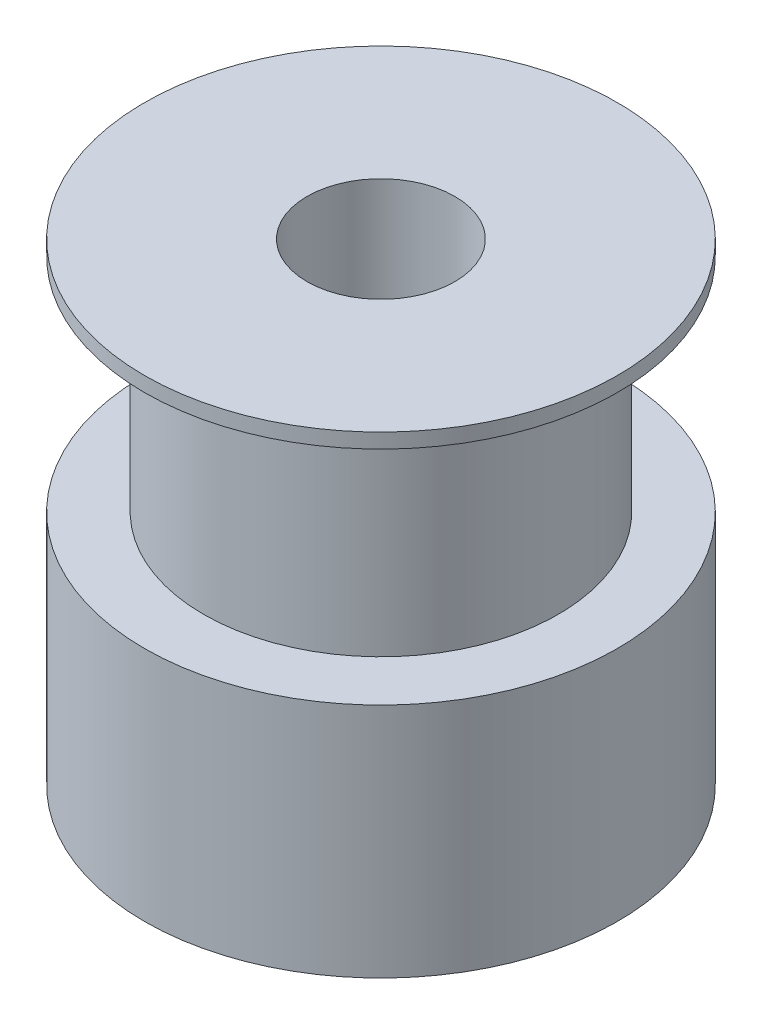
ISO-10303-21;
HEADER;
FILE_DESCRIPTION(('STEP AP214'),'2;1');
FILE_NAME('part.step','',(''),(''),'','','');
FILE_SCHEMA(('AUTOMOTIVE_DESIGN { 1 0 10303 214 1 1 1 1 }'));
ENDSEC;
DATA;
#1=APPLICATION_CONTEXT('core data for automotive mechanical design processes');
#2=APPLICATION_PROTOCOL_DEFINITION('international standard','automotive_design',2000,#1);
#3=PRODUCT_CONTEXT('',#1,'mechanical');
#4=PRODUCT('Part','Part','',(#3));
#5=PRODUCT_RELATED_PRODUCT_CATEGORY('part','',(#4));
#6=PRODUCT_DEFINITION_FORMATION('','',#4);
#7=PRODUCT_DEFINITION_CONTEXT('part definition',#1,'design');
#8=PRODUCT_DEFINITION('design','',#6,#7);
#9=PRODUCT_DEFINITION_SHAPE('','',#8);
#10=(LENGTH_UNIT() NAMED_UNIT(*) SI_UNIT(.MILLI.,.METRE.));
#11=(NAMED_UNIT(*) PLANE_ANGLE_UNIT() SI_UNIT($,.RADIAN.));
#12=(NAMED_UNIT(*) SI_UNIT($,.STERADIAN.) SOLID_ANGLE_UNIT());
#13=UNCERTAINTY_MEASURE_WITH_UNIT(LENGTH_MEASURE(1.E-05),#10,'distance_accuracy_value','');
#14=(GEOMETRIC_REPRESENTATION_CONTEXT(3) GLOBAL_UNCERTAINTY_ASSIGNED_CONTEXT((#13)) GLOBAL_UNIT_ASSIGNED_CONTEXT((#10,
#11,#12)) REPRESENTATION_CONTEXT('',''));
#15=CARTESIAN_POINT('',(0.,0.,0.));
#16=DIRECTION('',(0.,0.,1.));
#17=DIRECTION('',(1.,0.,0.));
#18=AXIS2_PLACEMENT_3D('',#15,#16,#17);
#19=CARTESIAN_POINT('',(0.,8.,0.));
#20=DIRECTION('',(0.,-1.,0.));
#21=DIRECTION('',(0.,0.,-1.));
#22=AXIS2_PLACEMENT_3D('',#19,#20,#21);
#23=CYLINDRICAL_SURFACE('',#22,8.);
#24=CARTESIAN_POINT('',(0.,8.,0.));
#25=DIRECTION('',(0.,1.,0.));
#26=DIRECTION('',(0.,0.,1.));
#27=AXIS2_PLACEMENT_3D('',#24,#25,#26);
#28=CIRCLE('',#27,8.);
#29=CARTESIAN_POINT('',(0.,8.,8.));
#30=VERTEX_POINT('',#29);
#31=EDGE_CURVE('E47',#30,#30,#28,.T.);
#32=ORIENTED_EDGE('',*,*,#31,.F.);
#33=EDGE_LOOP('',(#32));
#34=FACE_BOUND('',#33,.T.);
#35=CARTESIAN_POINT('',(0.,0.,0.));
#36=DIRECTION('',(0.,1.,0.));
#37=DIRECTION('',(0.,0.,1.));
#38=AXIS2_PLACEMENT_3D('',#35,#36,#37);
#39=CIRCLE('',#38,8.);
#40=CARTESIAN_POINT('',(0.,0.,8.));
#41=VERTEX_POINT('',#40);
#42=EDGE_CURVE('E42',#41,#41,#39,.T.);
#43=ORIENTED_EDGE('',*,*,#42,.T.);
#44=EDGE_LOOP('',(#43));
#45=FACE_BOUND('',#44,.T.);
#46=ADVANCED_FACE('F39',(#34,#45),#23,.T.);
#47=CARTESIAN_POINT('',(0.,8.,0.));
#48=DIRECTION('',(0.,1.,0.));
#49=DIRECTION('',(0.,0.,1.));
#50=AXIS2_PLACEMENT_3D('',#47,#48,#49);
#51=PLANE('',#50);
#52=CARTESIAN_POINT('',(0.,8.,0.));
#53=DIRECTION('',(0.,1.,0.));
#54=DIRECTION('',(0.,0.,1.));
#55=AXIS2_PLACEMENT_3D('',#52,#53,#54);
#56=CIRCLE('',#55,6.);
#57=CARTESIAN_POINT('',(0.,8.,6.));
#58=VERTEX_POINT('',#57);
#59=EDGE_CURVE('E10',#58,#58,#56,.T.);
#60=ORIENTED_EDGE('',*,*,#59,.F.);
#61=EDGE_LOOP('',(#60));
#62=FACE_BOUND('',#61,.T.);
#63=ORIENTED_EDGE('',*,*,#31,.T.);
#64=EDGE_LOOP('',(#63));
#65=FACE_BOUND('',#64,.T.);
#66=ADVANCED_FACE('F81',(#62,#65),#51,.T.);
#67=CARTESIAN_POINT('',(0.,0.,0.));
#68=DIRECTION('',(0.,1.,0.));
#69=DIRECTION('',(0.,0.,1.));
#70=AXIS2_PLACEMENT_3D('',#67,#68,#69);
#71=PLANE('',#70);
#72=CARTESIAN_POINT('',(0.,0.,0.));
#73=DIRECTION('',(0.,-1.,0.));
#74=DIRECTION('',(0.,0.,-1.));
#75=AXIS2_PLACEMENT_3D('',#72,#73,#74);
#76=CIRCLE('',#75,2.5);
#77=CARTESIAN_POINT('',(0.,0.,-2.5));
#78=VERTEX_POINT('',#77);
#79=EDGE_CURVE('E63',#78,#78,#76,.T.);
#80=ORIENTED_EDGE('',*,*,#79,.F.);
#81=EDGE_LOOP('',(#80));
#82=FACE_BOUND('',#81,.T.);
#83=ORIENTED_EDGE('',*,*,#42,.F.);
#84=EDGE_LOOP('',(#83));
#85=FACE_BOUND('',#84,.T.);
#86=ADVANCED_FACE('F77',(#82,#85),#71,.F.);
#87=CARTESIAN_POINT('',(0.,15.5,0.));
#88=DIRECTION('',(0.,-1.,0.));
#89=DIRECTION('',(0.,0.,-1.));
#90=AXIS2_PLACEMENT_3D('',#87,#88,#89);
#91=CYLINDRICAL_SURFACE('',#90,6.);
#92=CARTESIAN_POINT('',(0.,15.5,0.));
#93=DIRECTION('',(0.,1.,0.));
#94=DIRECTION('',(0.,0.,1.));
#95=AXIS2_PLACEMENT_3D('',#92,#93,#94);
#96=CIRCLE('',#95,6.);
#97=CARTESIAN_POINT('',(0.,15.5,6.));
#98=VERTEX_POINT('',#97);
#99=EDGE_CURVE('E54',#98,#98,#96,.T.);
#100=ORIENTED_EDGE('',*,*,#99,.F.);
#101=EDGE_LOOP('',(#100));
#102=FACE_BOUND('',#101,.T.);
#103=ORIENTED_EDGE('',*,*,#59,.T.);
#104=EDGE_LOOP('',(#103));
#105=FACE_BOUND('',#104,.T.);
#106=ADVANCED_FACE('F80',(#102,#105),#91,.T.);
#107=CARTESIAN_POINT('',(0.,16.,0.));
#108=DIRECTION('',(0.,-1.,0.));
#109=DIRECTION('',(0.,0.,-1.));
#110=AXIS2_PLACEMENT_3D('',#107,#108,#109);
#111=CYLINDRICAL_SURFACE('',#110,8.);
#112=CARTESIAN_POINT('',(0.,16.,0.));
#113=DIRECTION('',(0.,1.,0.));
#114=DIRECTION('',(0.,0.,1.));
#115=AXIS2_PLACEMENT_3D('',#112,#113,#114);
#116=CIRCLE('',#115,8.);
#117=CARTESIAN_POINT('',(0.,16.,8.));
#118=VERTEX_POINT('',#117);
#119=EDGE_CURVE('E58',#118,#118,#116,.T.);
#120=ORIENTED_EDGE('',*,*,#119,.F.);
#121=EDGE_LOOP('',(#120));
#122=FACE_BOUND('',#121,.T.);
#123=CARTESIAN_POINT('',(0.,15.5,0.));
#124=DIRECTION('',(0.,1.,0.));
#125=DIRECTION('',(0.,0.,1.));
#126=AXIS2_PLACEMENT_3D('',#123,#124,#125);
#127=CIRCLE('',#126,8.);
#128=CARTESIAN_POINT('',(0.,15.5,8.));
#129=VERTEX_POINT('',#128);
#130=EDGE_CURVE('E59',#129,#129,#127,.T.);
#131=ORIENTED_EDGE('',*,*,#130,.T.);
#132=EDGE_LOOP('',(#131));
#133=FACE_BOUND('',#132,.T.);
#134=ADVANCED_FACE('F100',(#122,#133),#111,.T.);
#135=CARTESIAN_POINT('',(0.,16.,0.));
#136=DIRECTION('',(0.,1.,0.));
#137=DIRECTION('',(0.,0.,1.));
#138=AXIS2_PLACEMENT_3D('',#135,#136,#137);
#139=PLANE('',#138);
#140=CARTESIAN_POINT('',(0.,16.,0.));
#141=DIRECTION('',(0.,1.,0.));
#142=DIRECTION('',(0.,0.,1.));
#143=AXIS2_PLACEMENT_3D('',#140,#141,#142);
#144=CIRCLE('',#143,2.5);
#145=CARTESIAN_POINT('',(0.,16.,2.5));
#146=VERTEX_POINT('',#145);
#147=EDGE_CURVE('E67',#146,#146,#144,.F.);
#148=ORIENTED_EDGE('',*,*,#147,.T.);
#149=EDGE_LOOP('',(#148));
#150=FACE_BOUND('',#149,.T.);
#151=ORIENTED_EDGE('',*,*,#119,.T.);
#152=EDGE_LOOP('',(#151));
#153=FACE_BOUND('',#152,.T.);
#154=ADVANCED_FACE('F104',(#150,#153),#139,.T.);
#155=CARTESIAN_POINT('',(0.,15.5,0.));
#156=DIRECTION('',(0.,1.,0.));
#157=DIRECTION('',(0.,0.,1.));
#158=AXIS2_PLACEMENT_3D('',#155,#156,#157);
#159=PLANE('',#158);
#160=ORIENTED_EDGE('',*,*,#99,.T.);
#161=EDGE_LOOP('',(#160));
#162=FACE_BOUND('',#161,.T.);
#163=ORIENTED_EDGE('',*,*,#130,.F.);
#164=EDGE_LOOP('',(#163));
#165=FACE_BOUND('',#164,.T.);
#166=ADVANCED_FACE('F106',(#162,#165),#159,.F.);
#167=CARTESIAN_POINT('',(0.,16.001,0.));
#168=DIRECTION('',(0.,-1.,0.));
#169=DIRECTION('',(0.,0.,-1.));
#170=AXIS2_PLACEMENT_3D('',#167,#168,#169);
#171=CYLINDRICAL_SURFACE('',#170,2.5);
#172=ORIENTED_EDGE('',*,*,#147,.F.);
#173=EDGE_LOOP('',(#172));
#174=FACE_BOUND('',#173,.T.);
#175=ORIENTED_EDGE('',*,*,#79,.T.);
#176=EDGE_LOOP('',(#175));
#177=FACE_BOUND('',#176,.T.);
#178=ADVANCED_FACE('F75',(#174,#177),#171,.F.);
#179=CLOSED_SHELL('',(#46,#66,#86,#106,#134,#154,#166,#178));
#180=MANIFOLD_SOLID_BREP('B2',#179);
#181=ADVANCED_BREP_SHAPE_REPRESENTATION('',(#18,#180),#14);
#182=SHAPE_DEFINITION_REPRESENTATION(#9,#181);
ENDSEC;
END-ISO-10303-21;
